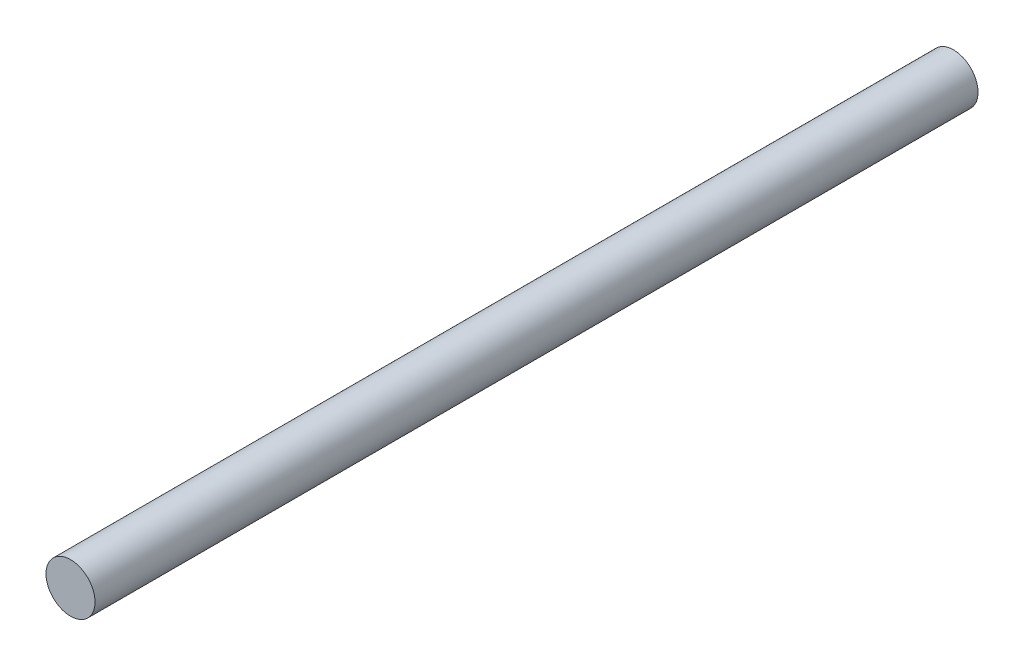
ISO-10303-21;
HEADER;
FILE_DESCRIPTION(('STEP AP214'),'2;1');
FILE_NAME('part.step','',(''),(''),'','','');
FILE_SCHEMA(('AUTOMOTIVE_DESIGN { 1 0 10303 214 1 1 1 1 }'));
ENDSEC;
DATA;
#1=APPLICATION_CONTEXT('core data for automotive mechanical design processes');
#2=APPLICATION_PROTOCOL_DEFINITION('international standard','automotive_design',2000,#1);
#3=PRODUCT_CONTEXT('',#1,'mechanical');
#4=PRODUCT('Part','Part','',(#3));
#5=PRODUCT_RELATED_PRODUCT_CATEGORY('part','',(#4));
#6=PRODUCT_DEFINITION_FORMATION('','',#4);
#7=PRODUCT_DEFINITION_CONTEXT('part definition',#1,'design');
#8=PRODUCT_DEFINITION('design','',#6,#7);
#9=PRODUCT_DEFINITION_SHAPE('','',#8);
#10=(LENGTH_UNIT() NAMED_UNIT(*) SI_UNIT(.MILLI.,.METRE.));
#11=(NAMED_UNIT(*) PLANE_ANGLE_UNIT() SI_UNIT($,.RADIAN.));
#12=(NAMED_UNIT(*) SI_UNIT($,.STERADIAN.) SOLID_ANGLE_UNIT());
#13=UNCERTAINTY_MEASURE_WITH_UNIT(LENGTH_MEASURE(1.E-05),#10,'distance_accuracy_value','');
#14=(GEOMETRIC_REPRESENTATION_CONTEXT(3) GLOBAL_UNCERTAINTY_ASSIGNED_CONTEXT((#13)) GLOBAL_UNIT_ASSIGNED_CONTEXT((#10,
#11,#12)) REPRESENTATION_CONTEXT('',''));
#15=CARTESIAN_POINT('',(0.,0.,0.));
#16=DIRECTION('',(0.,0.,1.));
#17=DIRECTION('',(1.,0.,0.));
#18=AXIS2_PLACEMENT_3D('',#15,#16,#17);
#19=CARTESIAN_POINT('',(0.,0.,90.));
#20=DIRECTION('',(0.,0.,-1.));
#21=DIRECTION('',(-1.,0.,0.));
#22=AXIS2_PLACEMENT_3D('',#19,#20,#21);
#23=CYLINDRICAL_SURFACE('',#22,2.5);
#24=CARTESIAN_POINT('',(0.,0.,90.));
#25=DIRECTION('',(0.,0.,1.));
#26=DIRECTION('',(1.,0.,0.));
#27=AXIS2_PLACEMENT_3D('',#24,#25,#26);
#28=CIRCLE('',#27,2.5);
#29=CARTESIAN_POINT('',(-2.5,0.,90.));
#30=VERTEX_POINT('',#29);
#31=EDGE_CURVE('E10',#30,#30,#28,.T.);
#32=CARTESIAN_POINT('',(0.,0.,0.));
#33=DIRECTION('',(0.,0.,1.));
#34=DIRECTION('',(1.,0.,0.));
#35=AXIS2_PLACEMENT_3D('',#32,#33,#34);
#36=CIRCLE('',#35,2.5);
#37=CARTESIAN_POINT('',(-2.5,0.,0.));
#38=VERTEX_POINT('',#37);
#39=EDGE_CURVE('E38',#38,#38,#36,.T.);
#40=CARTESIAN_POINT('',(-2.5,0.,90.));
#41=CARTESIAN_POINT('',(-2.5,0.,89.0625));
#42=CARTESIAN_POINT('',(-2.5,0.,88.125));
#43=CARTESIAN_POINT('',(-2.5,0.,86.25));
#44=CARTESIAN_POINT('',(-2.5,0.,85.3125));
#45=CARTESIAN_POINT('',(-2.5,0.,83.4375));
#46=CARTESIAN_POINT('',(-2.5,0.,82.5));
#47=CARTESIAN_POINT('',(-2.5,0.,80.625));
#48=CARTESIAN_POINT('',(-2.5,0.,79.6875));
#49=CARTESIAN_POINT('',(-2.5,0.,77.8125));
#50=CARTESIAN_POINT('',(-2.5,0.,76.875));
#51=CARTESIAN_POINT('',(-2.5,0.,75.));
#52=CARTESIAN_POINT('',(-2.5,0.,74.0625));
#53=CARTESIAN_POINT('',(-2.5,0.,72.1875));
#54=CARTESIAN_POINT('',(-2.5,0.,71.25));
#55=CARTESIAN_POINT('',(-2.5,0.,69.375));
#56=CARTESIAN_POINT('',(-2.5,0.,68.4375));
#57=CARTESIAN_POINT('',(-2.5,0.,66.5625));
#58=CARTESIAN_POINT('',(-2.5,0.,65.625));
#59=CARTESIAN_POINT('',(-2.5,0.,63.75));
#60=CARTESIAN_POINT('',(-2.5,0.,62.8125));
#61=CARTESIAN_POINT('',(-2.5,0.,60.9375));
#62=CARTESIAN_POINT('',(-2.5,0.,60.));
#63=CARTESIAN_POINT('',(-2.5,0.,58.125));
#64=CARTESIAN_POINT('',(-2.5,0.,57.1875));
#65=CARTESIAN_POINT('',(-2.5,0.,55.3125));
#66=CARTESIAN_POINT('',(-2.5,0.,54.375));
#67=CARTESIAN_POINT('',(-2.5,0.,52.5));
#68=CARTESIAN_POINT('',(-2.5,0.,51.5625));
#69=CARTESIAN_POINT('',(-2.5,0.,49.6875));
#70=CARTESIAN_POINT('',(-2.5,0.,48.75));
#71=CARTESIAN_POINT('',(-2.5,0.,46.875));
#72=CARTESIAN_POINT('',(-2.5,0.,45.9375));
#73=CARTESIAN_POINT('',(-2.5,0.,44.0625));
#74=CARTESIAN_POINT('',(-2.5,0.,43.125));
#75=CARTESIAN_POINT('',(-2.5,0.,41.25));
#76=CARTESIAN_POINT('',(-2.5,0.,40.3125));
#77=CARTESIAN_POINT('',(-2.5,0.,38.4375));
#78=CARTESIAN_POINT('',(-2.5,0.,37.5));
#79=CARTESIAN_POINT('',(-2.5,0.,35.625));
#80=CARTESIAN_POINT('',(-2.5,0.,34.6875));
#81=CARTESIAN_POINT('',(-2.5,0.,32.8125));
#82=CARTESIAN_POINT('',(-2.5,0.,31.875));
#83=CARTESIAN_POINT('',(-2.5,0.,30.));
#84=CARTESIAN_POINT('',(-2.5,0.,29.0625));
#85=CARTESIAN_POINT('',(-2.5,0.,27.1875));
#86=CARTESIAN_POINT('',(-2.5,0.,26.25));
#87=CARTESIAN_POINT('',(-2.5,0.,24.375));
#88=CARTESIAN_POINT('',(-2.5,0.,23.4375));
#89=CARTESIAN_POINT('',(-2.5,0.,21.5625));
#90=CARTESIAN_POINT('',(-2.5,0.,20.625));
#91=CARTESIAN_POINT('',(-2.5,0.,18.75));
#92=CARTESIAN_POINT('',(-2.5,0.,17.8125));
#93=CARTESIAN_POINT('',(-2.5,0.,15.9375));
#94=CARTESIAN_POINT('',(-2.5,0.,15.));
#95=CARTESIAN_POINT('',(-2.5,0.,13.125));
#96=CARTESIAN_POINT('',(-2.5,0.,12.1875));
#97=CARTESIAN_POINT('',(-2.5,0.,10.3125));
#98=CARTESIAN_POINT('',(-2.5,0.,9.37499999999999));
#99=CARTESIAN_POINT('',(-2.5,0.,7.49999999999999));
#100=CARTESIAN_POINT('',(-2.5,0.,6.56249999999999));
#101=CARTESIAN_POINT('',(-2.5,0.,4.68749999999999));
#102=CARTESIAN_POINT('',(-2.5,0.,3.74999999999998));
#103=CARTESIAN_POINT('',(-2.5,0.,1.87499999999998));
#104=CARTESIAN_POINT('',(-2.5,0.,0.937499999999986));
#105=CARTESIAN_POINT('',(-2.5,0.,0.));
#106=B_SPLINE_CURVE_WITH_KNOTS('',3,(#40,#41,#42,#43,#44,#45,#46,#47,#48,#49,#50,#51,#52,#53,
#54,#55,#56,#57,#58,#59,#60,#61,#62,#63,#64,#65,#66,#67,#68,#69,#70,#71,#72,#73,#74,#75,#76,#77,
#78,#79,#80,#81,#82,#83,#84,#85,#86,#87,#88,#89,#90,#91,#92,#93,#94,#95,#96,#97,#98,#99,#100,
#101,#102,#103,#104,#105),.UNSPECIFIED.,.F.,.F.,(4,2,2,2,2,2,2,2,2,2,2,2,2,2,2,2,2,2,2,2,2,2,2,
2,2,2,2,2,2,2,2,2,4),(0.,2.81250000000001,5.62500000000001,8.43750000000001,11.25,14.0625,
16.875,19.6875,22.5,25.3125,28.125,30.9375,33.75,36.5625,39.375,42.1875,45.,47.8125,50.625,
53.4375,56.25,59.0625,61.875,64.6875,67.5,70.3125,73.125,75.9375,78.75,81.5625,84.375,87.1875,
90.),.UNSPECIFIED.);
#107=EDGE_CURVE('BSEAM35',#30,#38,#106,.T.);
#108=ORIENTED_EDGE('',*,*,#31,.F.);
#109=ORIENTED_EDGE('',*,*,#39,.T.);
#110=ORIENTED_EDGE('',*,*,#107,.T.);
#111=ORIENTED_EDGE('',*,*,#107,.F.);
#112=EDGE_LOOP('',(#108,#110,#109,#111));
#113=FACE_BOUND('',#112,.T.);
#114=ADVANCED_FACE('F35',(#113),#23,.T.);
#115=CARTESIAN_POINT('',(0.,0.,90.));
#116=DIRECTION('',(0.,0.,1.));
#117=DIRECTION('',(1.,0.,0.));
#118=AXIS2_PLACEMENT_3D('',#115,#116,#117);
#119=PLANE('',#118);
#120=ORIENTED_EDGE('',*,*,#31,.T.);
#121=EDGE_LOOP('',(#120));
#122=FACE_BOUND('',#121,.T.);
#123=ADVANCED_FACE('F50',(#122),#119,.T.);
#124=CARTESIAN_POINT('',(0.,0.,0.));
#125=DIRECTION('',(0.,0.,1.));
#126=DIRECTION('',(1.,0.,0.));
#127=AXIS2_PLACEMENT_3D('',#124,#125,#126);
#128=PLANE('',#127);
#129=ORIENTED_EDGE('',*,*,#39,.F.);
#130=EDGE_LOOP('',(#129));
#131=FACE_BOUND('',#130,.T.);
#132=ADVANCED_FACE('F48',(#131),#128,.F.);
#133=CLOSED_SHELL('',(#114,#123,#132));
#134=MANIFOLD_SOLID_BREP('B2',#133);
#135=ADVANCED_BREP_SHAPE_REPRESENTATION('',(#18,#134),#14);
#136=SHAPE_DEFINITION_REPRESENTATION(#9,#135);
ENDSEC;
END-ISO-10303-21;
